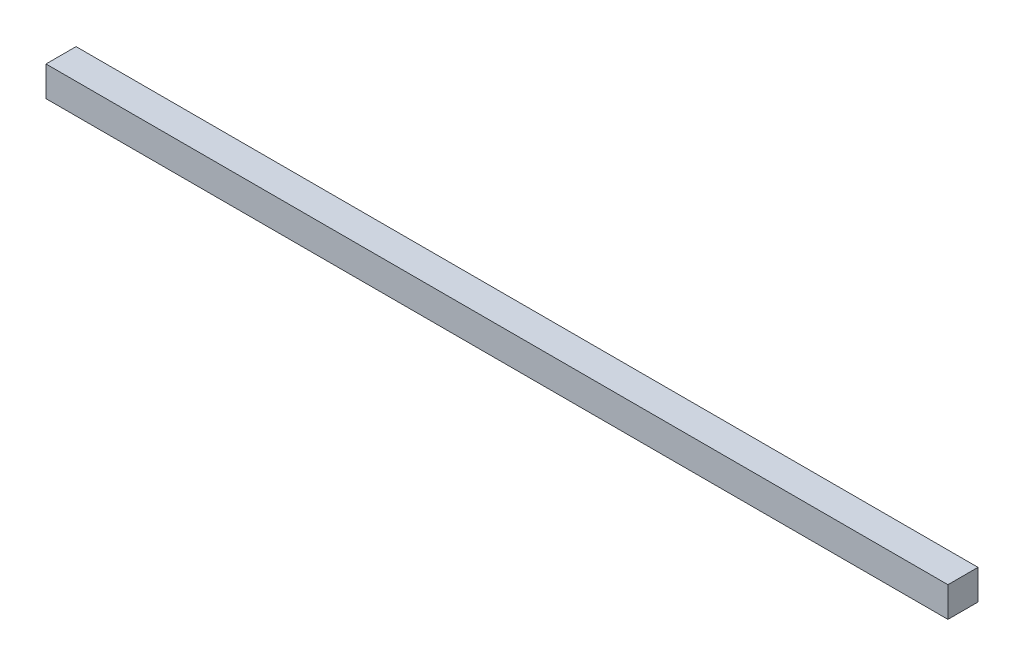
ISO-10303-21;
HEADER;
FILE_DESCRIPTION(('STEP AP214'),'2;1');
FILE_NAME('part.step','',(''),(''),'','','');
FILE_SCHEMA(('AUTOMOTIVE_DESIGN { 1 0 10303 214 1 1 1 1 }'));
ENDSEC;
DATA;
#1=APPLICATION_CONTEXT('core data for automotive mechanical design processes');
#2=APPLICATION_PROTOCOL_DEFINITION('international standard','automotive_design',2000,#1);
#3=PRODUCT_CONTEXT('',#1,'mechanical');
#4=PRODUCT('Part','Part','',(#3));
#5=PRODUCT_RELATED_PRODUCT_CATEGORY('part','',(#4));
#6=PRODUCT_DEFINITION_FORMATION('','',#4);
#7=PRODUCT_DEFINITION_CONTEXT('part definition',#1,'design');
#8=PRODUCT_DEFINITION('design','',#6,#7);
#9=PRODUCT_DEFINITION_SHAPE('','',#8);
#10=(LENGTH_UNIT() NAMED_UNIT(*) SI_UNIT(.MILLI.,.METRE.));
#11=(NAMED_UNIT(*) PLANE_ANGLE_UNIT() SI_UNIT($,.RADIAN.));
#12=(NAMED_UNIT(*) SI_UNIT($,.STERADIAN.) SOLID_ANGLE_UNIT());
#13=UNCERTAINTY_MEASURE_WITH_UNIT(LENGTH_MEASURE(1.E-05),#10,'distance_accuracy_value','');
#14=(GEOMETRIC_REPRESENTATION_CONTEXT(3) GLOBAL_UNCERTAINTY_ASSIGNED_CONTEXT((#13)) GLOBAL_UNIT_ASSIGNED_CONTEXT((#10,
#11,#12)) REPRESENTATION_CONTEXT('',''));
#15=CARTESIAN_POINT('',(0.,0.,0.));
#16=DIRECTION('',(0.,0.,1.));
#17=DIRECTION('',(1.,0.,0.));
#18=AXIS2_PLACEMENT_3D('',#15,#16,#17);
#19=CARTESIAN_POINT('',(-571.5,19.0500000000001,38.1));
#20=DIRECTION('',(1.,0.,0.));
#21=DIRECTION('',(0.,0.,-1.));
#22=AXIS2_PLACEMENT_3D('',#19,#20,#21);
#23=PLANE('',#22);
#24=DIRECTION('',(0.,-1.,0.));
#25=VECTOR('',#24,1.);
#26=CARTESIAN_POINT('',(-571.5,19.0500000000001,0.));
#27=LINE('',#26,#25);
#28=CARTESIAN_POINT('',(-571.5,19.0500000000001,0.));
#29=VERTEX_POINT('',#28);
#30=CARTESIAN_POINT('',(-571.5,-19.0500000000001,0.));
#31=VERTEX_POINT('',#30);
#32=EDGE_CURVE('E95',#29,#31,#27,.T.);
#33=ORIENTED_EDGE('',*,*,#32,.T.);
#34=DIRECTION('',(0.,0.,-1.));
#35=VECTOR('',#34,1.);
#36=CARTESIAN_POINT('',(-571.5,-19.0500000000001,38.1));
#37=LINE('',#36,#35);
#38=CARTESIAN_POINT('',(-571.5,-19.0500000000001,38.1));
#39=VERTEX_POINT('',#38);
#40=EDGE_CURVE('E11',#39,#31,#37,.T.);
#41=ORIENTED_EDGE('',*,*,#40,.F.);
#42=DIRECTION('',(0.,-1.,0.));
#43=VECTOR('',#42,1.);
#44=CARTESIAN_POINT('',(-571.5,19.0500000000001,38.1));
#45=LINE('',#44,#43);
#46=CARTESIAN_POINT('',(-571.5,19.0500000000001,38.1));
#47=VERTEX_POINT('',#46);
#48=EDGE_CURVE('E83',#47,#39,#45,.T.);
#49=ORIENTED_EDGE('',*,*,#48,.F.);
#50=DIRECTION('',(0.,0.,-1.));
#51=VECTOR('',#50,1.);
#52=CARTESIAN_POINT('',(-571.5,19.0500000000001,38.1));
#53=LINE('',#52,#51);
#54=EDGE_CURVE('E91',#47,#29,#53,.T.);
#55=ORIENTED_EDGE('',*,*,#54,.T.);
#56=EDGE_LOOP('',(#33,#41,#49,#55));
#57=FACE_BOUND('',#56,.T.);
#58=ADVANCED_FACE('F32',(#57),#23,.F.);
#59=CARTESIAN_POINT('',(-571.5,-19.0500000000001,38.1));
#60=DIRECTION('',(0.,1.,0.));
#61=DIRECTION('',(-1.,0.,0.));
#62=AXIS2_PLACEMENT_3D('',#59,#60,#61);
#63=PLANE('',#62);
#64=DIRECTION('',(1.,0.,0.));
#65=VECTOR('',#64,1.);
#66=CARTESIAN_POINT('',(-571.5,-19.0500000000001,0.));
#67=LINE('',#66,#65);
#68=CARTESIAN_POINT('',(571.5,-19.05,0.));
#69=VERTEX_POINT('',#68);
#70=EDGE_CURVE('E87',#31,#69,#67,.T.);
#71=ORIENTED_EDGE('',*,*,#70,.T.);
#72=DIRECTION('',(0.,0.,-1.));
#73=VECTOR('',#72,1.);
#74=CARTESIAN_POINT('',(571.5,-19.05,38.1));
#75=LINE('',#74,#73);
#76=CARTESIAN_POINT('',(571.5,-19.05,38.1));
#77=VERTEX_POINT('',#76);
#78=EDGE_CURVE('E40',#77,#69,#75,.T.);
#79=ORIENTED_EDGE('',*,*,#78,.F.);
#80=DIRECTION('',(1.,0.,0.));
#81=VECTOR('',#80,1.);
#82=CARTESIAN_POINT('',(-571.5,-19.0500000000001,38.1));
#83=LINE('',#82,#81);
#84=EDGE_CURVE('E78',#39,#77,#83,.T.);
#85=ORIENTED_EDGE('',*,*,#84,.F.);
#86=ORIENTED_EDGE('',*,*,#40,.T.);
#87=EDGE_LOOP('',(#71,#79,#85,#86));
#88=FACE_BOUND('',#87,.T.);
#89=ADVANCED_FACE('F86',(#88),#63,.F.);
#90=CARTESIAN_POINT('',(571.5,19.05,38.1));
#91=DIRECTION('',(-1.,0.,0.));
#92=DIRECTION('',(0.,0.,1.));
#93=AXIS2_PLACEMENT_3D('',#90,#91,#92);
#94=PLANE('',#93);
#95=DIRECTION('',(0.,1.,0.));
#96=VECTOR('',#95,1.);
#97=CARTESIAN_POINT('',(571.5,19.05,0.));
#98=LINE('',#97,#96);
#99=CARTESIAN_POINT('',(571.5,19.05,0.));
#100=VERTEX_POINT('',#99);
#101=EDGE_CURVE('E65',#69,#100,#98,.T.);
#102=ORIENTED_EDGE('',*,*,#101,.T.);
#103=DIRECTION('',(0.,0.,-1.));
#104=VECTOR('',#103,1.);
#105=CARTESIAN_POINT('',(571.5,19.05,38.1));
#106=LINE('',#105,#104);
#107=CARTESIAN_POINT('',(571.5,19.05,38.1));
#108=VERTEX_POINT('',#107);
#109=EDGE_CURVE('E88',#108,#100,#106,.T.);
#110=ORIENTED_EDGE('',*,*,#109,.F.);
#111=DIRECTION('',(0.,1.,0.));
#112=VECTOR('',#111,1.);
#113=CARTESIAN_POINT('',(571.5,19.05,38.1));
#114=LINE('',#113,#112);
#115=EDGE_CURVE('E81',#77,#108,#114,.T.);
#116=ORIENTED_EDGE('',*,*,#115,.F.);
#117=ORIENTED_EDGE('',*,*,#78,.T.);
#118=EDGE_LOOP('',(#102,#110,#116,#117));
#119=FACE_BOUND('',#118,.T.);
#120=ADVANCED_FACE('F89',(#119),#94,.F.);
#121=CARTESIAN_POINT('',(-571.5,19.0500000000001,38.1));
#122=DIRECTION('',(0.,-1.,0.));
#123=DIRECTION('',(1.,0.,0.));
#124=AXIS2_PLACEMENT_3D('',#121,#122,#123);
#125=PLANE('',#124);
#126=DIRECTION('',(-1.,0.,0.));
#127=VECTOR('',#126,1.);
#128=CARTESIAN_POINT('',(-571.5,19.0500000000001,0.));
#129=LINE('',#128,#127);
#130=EDGE_CURVE('E71',#100,#29,#129,.T.);
#131=ORIENTED_EDGE('',*,*,#130,.T.);
#132=ORIENTED_EDGE('',*,*,#54,.F.);
#133=DIRECTION('',(-1.,0.,0.));
#134=VECTOR('',#133,1.);
#135=CARTESIAN_POINT('',(-571.5,19.0500000000001,38.1));
#136=LINE('',#135,#134);
#137=EDGE_CURVE('E48',#108,#47,#136,.T.);
#138=ORIENTED_EDGE('',*,*,#137,.F.);
#139=ORIENTED_EDGE('',*,*,#109,.T.);
#140=EDGE_LOOP('',(#131,#132,#138,#139));
#141=FACE_BOUND('',#140,.T.);
#142=ADVANCED_FACE('F102',(#141),#125,.F.);
#143=CARTESIAN_POINT('',(0.,0.,38.1));
#144=DIRECTION('',(0.,0.,1.));
#145=DIRECTION('',(1.,0.,0.));
#146=AXIS2_PLACEMENT_3D('',#143,#144,#145);
#147=PLANE('',#146);
#148=ORIENTED_EDGE('',*,*,#48,.T.);
#149=ORIENTED_EDGE('',*,*,#84,.T.);
#150=ORIENTED_EDGE('',*,*,#115,.T.);
#151=ORIENTED_EDGE('',*,*,#137,.T.);
#152=EDGE_LOOP('',(#148,#149,#150,#151));
#153=FACE_BOUND('',#152,.T.);
#154=ADVANCED_FACE('F79',(#153),#147,.T.);
#155=CARTESIAN_POINT('',(0.,0.,0.));
#156=DIRECTION('',(0.,0.,1.));
#157=DIRECTION('',(1.,0.,0.));
#158=AXIS2_PLACEMENT_3D('',#155,#156,#157);
#159=PLANE('',#158);
#160=ORIENTED_EDGE('',*,*,#32,.F.);
#161=ORIENTED_EDGE('',*,*,#130,.F.);
#162=ORIENTED_EDGE('',*,*,#101,.F.);
#163=ORIENTED_EDGE('',*,*,#70,.F.);
#164=EDGE_LOOP('',(#160,#161,#162,#163));
#165=FACE_BOUND('',#164,.T.);
#166=ADVANCED_FACE('F105',(#165),#159,.F.);
#167=CLOSED_SHELL('',(#58,#89,#120,#142,#154,#166));
#168=MANIFOLD_SOLID_BREP('B2',#167);
#169=ADVANCED_BREP_SHAPE_REPRESENTATION('',(#18,#168),#14);
#170=SHAPE_DEFINITION_REPRESENTATION(#9,#169);
ENDSEC;
END-ISO-10303-21;
